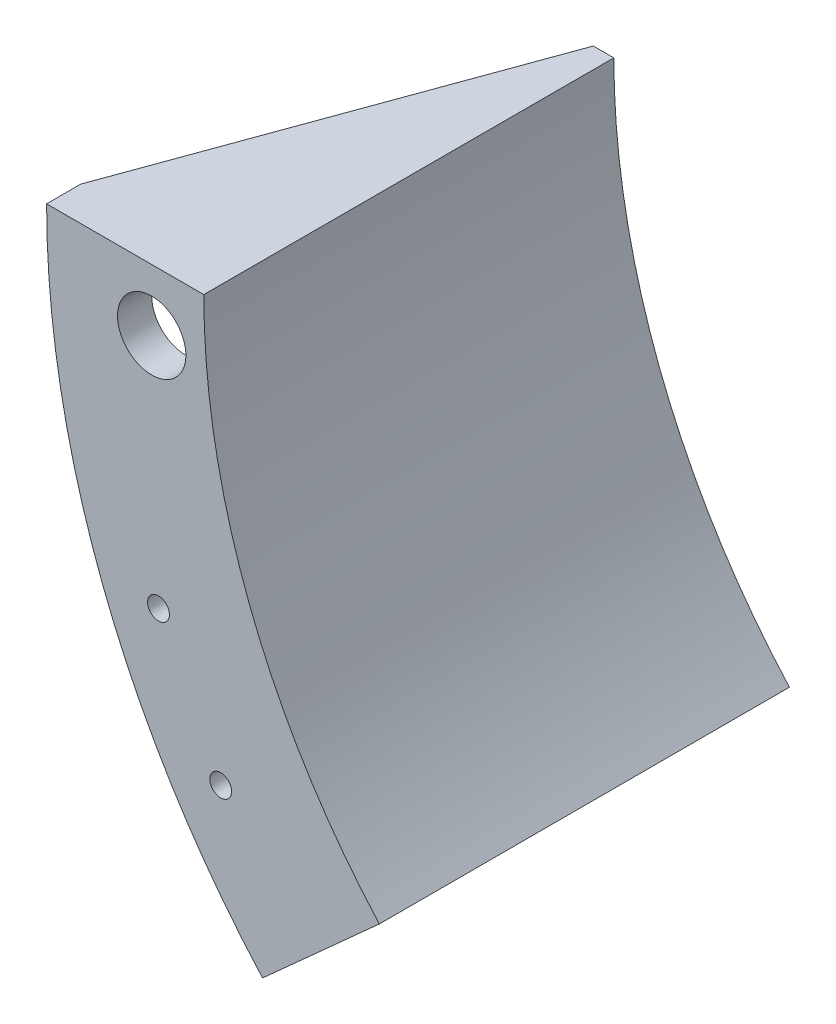
ISO-10303-21;
HEADER;
FILE_DESCRIPTION(('STEP AP214'),'2;1');
FILE_NAME('part.step','',(''),(''),'','','');
FILE_SCHEMA(('AUTOMOTIVE_DESIGN { 1 0 10303 214 1 1 1 1 }'));
ENDSEC;
DATA;
#1=APPLICATION_CONTEXT('core data for automotive mechanical design processes');
#2=APPLICATION_PROTOCOL_DEFINITION('international standard','automotive_design',2000,#1);
#3=PRODUCT_CONTEXT('',#1,'mechanical');
#4=PRODUCT('Part','Part','',(#3));
#5=PRODUCT_RELATED_PRODUCT_CATEGORY('part','',(#4));
#6=PRODUCT_DEFINITION_FORMATION('','',#4);
#7=PRODUCT_DEFINITION_CONTEXT('part definition',#1,'design');
#8=PRODUCT_DEFINITION('design','',#6,#7);
#9=PRODUCT_DEFINITION_SHAPE('','',#8);
#10=(LENGTH_UNIT() NAMED_UNIT(*) SI_UNIT(.MILLI.,.METRE.));
#11=(NAMED_UNIT(*) PLANE_ANGLE_UNIT() SI_UNIT($,.RADIAN.));
#12=(NAMED_UNIT(*) SI_UNIT($,.STERADIAN.) SOLID_ANGLE_UNIT());
#13=UNCERTAINTY_MEASURE_WITH_UNIT(LENGTH_MEASURE(1.E-05),#10,'distance_accuracy_value','');
#14=(GEOMETRIC_REPRESENTATION_CONTEXT(3) GLOBAL_UNCERTAINTY_ASSIGNED_CONTEXT((#13)) GLOBAL_UNIT_ASSIGNED_CONTEXT((#10,
#11,#12)) REPRESENTATION_CONTEXT('',''));
#15=CARTESIAN_POINT('',(0.,0.,0.));
#16=DIRECTION('',(0.,0.,1.));
#17=DIRECTION('',(1.,0.,0.));
#18=AXIS2_PLACEMENT_3D('',#15,#16,#17);
#19=CARTESIAN_POINT('',(0.,0.,55.));
#20=DIRECTION('',(0.,0.,1.));
#21=DIRECTION('',(1.,0.,0.));
#22=AXIS2_PLACEMENT_3D('',#19,#20,#21);
#23=PLANE('',#22);
#24=CARTESIAN_POINT('',(0.,0.,55.));
#25=DIRECTION('',(0.,0.,1.));
#26=DIRECTION('',(1.,0.,0.));
#27=AXIS2_PLACEMENT_3D('',#24,#25,#26);
#28=CIRCLE('',#27,103.);
#29=CARTESIAN_POINT('',(-102.922300790451,-4.,55.));
#30=VERTEX_POINT('',#29);
#31=CARTESIAN_POINT('',(-102.641738044954,-8.58333333333333,55.));
#32=VERTEX_POINT('',#31);
#33=EDGE_CURVE('E126',#30,#32,#28,.T.);
#34=ORIENTED_EDGE('',*,*,#33,.T.);
#35=CARTESIAN_POINT('',(-107.624346687913,-9.,55.));
#36=DIRECTION('',(0.,0.,-1.));
#37=DIRECTION('',(-1.,0.,0.));
#38=AXIS2_PLACEMENT_3D('',#35,#36,#37);
#39=CIRCLE('',#38,5.);
#40=CARTESIAN_POINT('',(-107.624346687913,-4.,55.));
#41=VERTEX_POINT('',#40);
#42=EDGE_CURVE('E49',#41,#32,#39,.T.);
#43=ORIENTED_EDGE('',*,*,#42,.F.);
#44=DIRECTION('',(1.,0.,0.));
#45=VECTOR('',#44,1.);
#46=CARTESIAN_POINT('',(-123.,-4.,55.));
#47=LINE('',#46,#45);
#48=EDGE_CURVE('E123',#41,#30,#47,.T.);
#49=ORIENTED_EDGE('',*,*,#48,.T.);
#50=EDGE_LOOP('',(#34,#43,#49));
#51=FACE_BOUND('',#50,.T.);
#52=ADVANCED_FACE('F35',(#51),#23,.F.);
#53=CARTESIAN_POINT('',(0.,0.,60.));
#54=DIRECTION('',(0.,0.,-1.));
#55=DIRECTION('',(-1.,0.,0.));
#56=AXIS2_PLACEMENT_3D('',#53,#54,#55);
#57=CYLINDRICAL_SURFACE('',#56,103.);
#58=CARTESIAN_POINT('',(0.,0.,0.));
#59=DIRECTION('',(0.,0.,1.));
#60=DIRECTION('',(1.,0.,0.));
#61=AXIS2_PLACEMENT_3D('',#58,#59,#60);
#62=CIRCLE('',#61,103.);
#63=CARTESIAN_POINT('',(-102.922300790451,-4.,0.));
#64=VERTEX_POINT('',#63);
#65=CARTESIAN_POINT('',(-79.1626976840863,-65.895882233854,0.));
#66=VERTEX_POINT('',#65);
#67=EDGE_CURVE('E195',#64,#66,#62,.T.);
#68=ORIENTED_EDGE('',*,*,#67,.T.);
#69=DIRECTION('',(0.,0.,-1.));
#70=VECTOR('',#69,1.);
#71=CARTESIAN_POINT('',(-79.1626976840863,-65.895882233854,60.));
#72=LINE('',#71,#70);
#73=CARTESIAN_POINT('',(-79.1626976840863,-65.895882233854,55.));
#74=VERTEX_POINT('',#73);
#75=EDGE_CURVE('E149',#66,#74,#72,.F.);
#76=ORIENTED_EDGE('',*,*,#75,.T.);
#77=EDGE_CURVE('E177',#32,#74,#28,.T.);
#78=ORIENTED_EDGE('',*,*,#77,.F.);
#79=ORIENTED_EDGE('',*,*,#33,.F.);
#80=DIRECTION('',(0.,0.,-1.));
#81=VECTOR('',#80,1.);
#82=CARTESIAN_POINT('',(-102.922300790451,-4.,60.));
#83=LINE('',#82,#81);
#84=EDGE_CURVE('E133',#30,#64,#83,.T.);
#85=ORIENTED_EDGE('',*,*,#84,.T.);
#86=EDGE_LOOP('',(#68,#76,#78,#79,#85));
#87=FACE_BOUND('',#86,.T.);
#88=ADVANCED_FACE('F257',(#87),#57,.T.);
#89=CARTESIAN_POINT('',(0.,0.,60.));
#90=DIRECTION('',(0.,0.,-1.));
#91=DIRECTION('',(-1.,0.,0.));
#92=AXIS2_PLACEMENT_3D('',#89,#90,#91);
#93=CYLINDRICAL_SURFACE('',#92,100.);
#94=CARTESIAN_POINT('',(0.,0.,0.));
#95=DIRECTION('',(0.,0.,-1.));
#96=DIRECTION('',(1.,0.,0.));
#97=AXIS2_PLACEMENT_3D('',#94,#95,#96);
#98=CIRCLE('',#97,100.);
#99=CARTESIAN_POINT('',(-74.3144825477393,-66.913060635886,0.));
#100=VERTEX_POINT('',#99);
#101=CARTESIAN_POINT('',(-100.,0.,0.));
#102=VERTEX_POINT('',#101);
#103=EDGE_CURVE('E181',#100,#102,#98,.T.);
#104=ORIENTED_EDGE('',*,*,#103,.T.);
#105=DIRECTION('',(0.,0.,-1.));
#106=VECTOR('',#105,1.);
#107=CARTESIAN_POINT('',(-100.,0.,60.));
#108=LINE('',#107,#106);
#109=CARTESIAN_POINT('',(-100.,0.,60.));
#110=VERTEX_POINT('',#109);
#111=EDGE_CURVE('E11',#110,#102,#108,.T.);
#112=ORIENTED_EDGE('',*,*,#111,.F.);
#113=CARTESIAN_POINT('',(0.,0.,60.));
#114=DIRECTION('',(0.,0.,-1.));
#115=DIRECTION('',(1.,0.,0.));
#116=AXIS2_PLACEMENT_3D('',#113,#114,#115);
#117=CIRCLE('',#116,100.);
#118=CARTESIAN_POINT('',(-74.3144825477393,-66.913060635886,60.));
#119=VERTEX_POINT('',#118);
#120=EDGE_CURVE('E182',#119,#110,#117,.T.);
#121=ORIENTED_EDGE('',*,*,#120,.F.);
#122=DIRECTION('',(0.,0.,-1.));
#123=VECTOR('',#122,1.);
#124=CARTESIAN_POINT('',(-74.3144825477393,-66.913060635886,60.));
#125=LINE('',#124,#123);
#126=EDGE_CURVE('E43',#119,#100,#125,.T.);
#127=ORIENTED_EDGE('',*,*,#126,.T.);
#128=EDGE_LOOP('',(#104,#112,#121,#127));
#129=FACE_BOUND('',#128,.T.);
#130=ADVANCED_FACE('F37',(#129),#93,.F.);
#131=CARTESIAN_POINT('',(-100.,0.,60.));
#132=DIRECTION('',(0.,-1.,0.));
#133=DIRECTION('',(0.,0.,-1.));
#134=AXIS2_PLACEMENT_3D('',#131,#132,#133);
#135=PLANE('',#134);
#136=DIRECTION('',(-1.,0.,0.));
#137=VECTOR('',#136,1.);
#138=CARTESIAN_POINT('',(-100.,0.,0.));
#139=LINE('',#138,#137);
#140=CARTESIAN_POINT('',(-103.,0.,0.));
#141=VERTEX_POINT('',#140);
#142=EDGE_CURVE('E192',#102,#141,#139,.T.);
#143=ORIENTED_EDGE('',*,*,#142,.T.);
#144=DIRECTION('',(-0.341743063086705,0.,0.939793423488437));
#145=VECTOR('',#144,1.);
#146=CARTESIAN_POINT('',(-103.,0.,0.));
#147=LINE('',#146,#145);
#148=CARTESIAN_POINT('',(-123.,0.,55.));
#149=VERTEX_POINT('',#148);
#150=EDGE_CURVE('E145',#141,#149,#147,.T.);
#151=ORIENTED_EDGE('',*,*,#150,.T.);
#152=DIRECTION('',(0.,0.,1.));
#153=VECTOR('',#152,1.);
#154=CARTESIAN_POINT('',(-123.,0.,55.));
#155=LINE('',#154,#153);
#156=CARTESIAN_POINT('',(-123.,0.,60.));
#157=VERTEX_POINT('',#156);
#158=EDGE_CURVE('E170',#149,#157,#155,.T.);
#159=ORIENTED_EDGE('',*,*,#158,.T.);
#160=DIRECTION('',(-1.,0.,0.));
#161=VECTOR('',#160,1.);
#162=CARTESIAN_POINT('',(-100.,0.,60.));
#163=LINE('',#162,#161);
#164=EDGE_CURVE('E185',#110,#157,#163,.T.);
#165=ORIENTED_EDGE('',*,*,#164,.F.);
#166=ORIENTED_EDGE('',*,*,#111,.T.);
#167=EDGE_LOOP('',(#143,#151,#159,#165,#166));
#168=FACE_BOUND('',#167,.T.);
#169=ADVANCED_FACE('F216',(#168),#135,.F.);
#170=CARTESIAN_POINT('',(-74.3144825477393,-66.913060635886,60.));
#171=DIRECTION('',(-0.669130606358863,0.74314482547739,0.));
#172=DIRECTION('',(-0.74314482547739,-0.669130606358863,0.));
#173=AXIS2_PLACEMENT_3D('',#170,#171,#172);
#174=PLANE('',#173);
#175=DIRECTION('',(0.253964588975677,0.228670743022142,-0.939793423488437));
#176=VECTOR('',#175,1.);
#177=CARTESIAN_POINT('',(-91.4068135337189,-82.3030645821402,55.));
#178=LINE('',#177,#176);
#179=CARTESIAN_POINT('',(-91.4068135337193,-82.3030645821398,55.));
#180=VERTEX_POINT('',#179);
#181=CARTESIAN_POINT('',(-76.5439170241711,-68.9204524549629,0.));
#182=VERTEX_POINT('',#181);
#183=EDGE_CURVE('E209',#180,#182,#178,.T.);
#184=ORIENTED_EDGE('',*,*,#183,.T.);
#185=DIRECTION('',(0.74314482547739,0.669130606358863,0.));
#186=VECTOR('',#185,1.);
#187=CARTESIAN_POINT('',(-74.3144825477393,-66.913060635886,0.));
#188=LINE('',#187,#186);
#189=EDGE_CURVE('E186',#182,#100,#188,.T.);
#190=ORIENTED_EDGE('',*,*,#189,.T.);
#191=ORIENTED_EDGE('',*,*,#126,.F.);
#192=DIRECTION('',(0.74314482547739,0.669130606358863,0.));
#193=VECTOR('',#192,1.);
#194=CARTESIAN_POINT('',(-74.3144825477393,-66.913060635886,60.));
#195=LINE('',#194,#193);
#196=CARTESIAN_POINT('',(-91.4068135337193,-82.3030645821398,60.));
#197=VERTEX_POINT('',#196);
#198=EDGE_CURVE('E188',#197,#119,#195,.T.);
#199=ORIENTED_EDGE('',*,*,#198,.F.);
#200=DIRECTION('',(0.,0.,1.));
#201=VECTOR('',#200,1.);
#202=CARTESIAN_POINT('',(-91.4068135337193,-82.3030645821398,55.));
#203=LINE('',#202,#201);
#204=EDGE_CURVE('E174',#180,#197,#203,.T.);
#205=ORIENTED_EDGE('',*,*,#204,.F.);
#206=EDGE_LOOP('',(#184,#190,#191,#199,#205));
#207=FACE_BOUND('',#206,.T.);
#208=ADVANCED_FACE('F207',(#207),#174,.F.);
#209=CARTESIAN_POINT('',(0.,0.,60.));
#210=DIRECTION('',(0.,0.,1.));
#211=DIRECTION('',(1.,0.,0.));
#212=AXIS2_PLACEMENT_3D('',#209,#210,#211);
#213=PLANE('',#212);
#214=CARTESIAN_POINT('',(-107.624346687913,-9.,60.));
#215=DIRECTION('',(0.,0.,-1.));
#216=DIRECTION('',(-1.,0.,0.));
#217=AXIS2_PLACEMENT_3D('',#214,#215,#216);
#218=CIRCLE('',#217,5.);
#219=CARTESIAN_POINT('',(-112.624346687913,-9.,60.));
#220=VERTEX_POINT('',#219);
#221=EDGE_CURVE('E127',#220,#220,#218,.T.);
#222=ORIENTED_EDGE('',*,*,#221,.T.);
#223=EDGE_LOOP('',(#222));
#224=FACE_BOUND('',#223,.T.);
#225=CARTESIAN_POINT('',(-97.5255310579886,-60.9407153868192,60.));
#226=DIRECTION('',(0.,0.,-1.));
#227=DIRECTION('',(-1.,0.,0.));
#228=AXIS2_PLACEMENT_3D('',#225,#226,#227);
#229=CIRCLE('',#228,1.60000000000001);
#230=CARTESIAN_POINT('',(-99.1255310579886,-60.9407153868192,60.));
#231=VERTEX_POINT('',#230);
#232=EDGE_CURVE('E156',#231,#231,#229,.T.);
#233=ORIENTED_EDGE('',*,*,#232,.T.);
#234=EDGE_LOOP('',(#233));
#235=FACE_BOUND('',#234,.T.);
#236=CARTESIAN_POINT('',(-106.62614327518,-43.0797582428313,60.));
#237=DIRECTION('',(0.,0.,-1.));
#238=DIRECTION('',(-1.,0.,0.));
#239=AXIS2_PLACEMENT_3D('',#236,#237,#238);
#240=CIRCLE('',#239,1.60000000000001);
#241=CARTESIAN_POINT('',(-108.22614327518,-43.0797582428313,60.));
#242=VERTEX_POINT('',#241);
#243=EDGE_CURVE('E163',#242,#242,#240,.T.);
#244=ORIENTED_EDGE('',*,*,#243,.T.);
#245=EDGE_LOOP('',(#244));
#246=FACE_BOUND('',#245,.T.);
#247=ORIENTED_EDGE('',*,*,#164,.T.);
#248=CARTESIAN_POINT('',(0.,0.,60.));
#249=DIRECTION('',(0.,0.,1.));
#250=DIRECTION('',(1.,0.,0.));
#251=AXIS2_PLACEMENT_3D('',#248,#249,#250);
#252=CIRCLE('',#251,123.);
#253=EDGE_CURVE('E159',#157,#197,#252,.T.);
#254=ORIENTED_EDGE('',*,*,#253,.T.);
#255=ORIENTED_EDGE('',*,*,#198,.T.);
#256=ORIENTED_EDGE('',*,*,#120,.T.);
#257=EDGE_LOOP('',(#247,#254,#255,#256));
#258=FACE_BOUND('',#257,.T.);
#259=ADVANCED_FACE('F220',(#224,#235,#246,#258),#213,.T.);
#260=CARTESIAN_POINT('',(0.,0.,0.));
#261=DIRECTION('',(0.,0.,1.));
#262=DIRECTION('',(1.,0.,0.));
#263=AXIS2_PLACEMENT_3D('',#260,#261,#262);
#264=PLANE('',#263);
#265=ORIENTED_EDGE('',*,*,#103,.F.);
#266=ORIENTED_EDGE('',*,*,#189,.F.);
#267=DIRECTION('',(0.669130606358863,-0.74314482547739,0.));
#268=VECTOR('',#267,1.);
#269=CARTESIAN_POINT('',(-79.2204394496066,-65.9478731530534,0.));
#270=LINE('',#269,#268);
#271=CARTESIAN_POINT('',(-79.2204394496066,-65.9478731530534,0.));
#272=VERTEX_POINT('',#271);
#273=EDGE_CURVE('E248',#272,#182,#270,.T.);
#274=ORIENTED_EDGE('',*,*,#273,.F.);
#275=DIRECTION('',(0.74314482547739,0.669130606358863,0.));
#276=VECTOR('',#275,1.);
#277=CARTESIAN_POINT('',(-79.2204394496066,-65.9478731530534,0.));
#278=LINE('',#277,#276);
#279=EDGE_CURVE('E241',#272,#66,#278,.T.);
#280=ORIENTED_EDGE('',*,*,#279,.T.);
#281=ORIENTED_EDGE('',*,*,#67,.F.);
#282=DIRECTION('',(-1.,0.,0.));
#283=VECTOR('',#282,1.);
#284=CARTESIAN_POINT('',(-100.,-4.,0.));
#285=LINE('',#284,#283);
#286=CARTESIAN_POINT('',(-103.,-4.,0.));
#287=VERTEX_POINT('',#286);
#288=EDGE_CURVE('E148',#64,#287,#285,.T.);
#289=ORIENTED_EDGE('',*,*,#288,.T.);
#290=DIRECTION('',(0.,1.,0.));
#291=VECTOR('',#290,1.);
#292=CARTESIAN_POINT('',(-103.,-4.,0.));
#293=LINE('',#292,#291);
#294=EDGE_CURVE('E141',#287,#141,#293,.T.);
#295=ORIENTED_EDGE('',*,*,#294,.T.);
#296=ORIENTED_EDGE('',*,*,#142,.F.);
#297=EDGE_LOOP('',(#265,#266,#274,#280,#281,#289,#295,#296));
#298=FACE_BOUND('',#297,.T.);
#299=ADVANCED_FACE('F212',(#298),#264,.F.);
#300=CARTESIAN_POINT('',(-97.5255310579886,-60.9407153868192,55.));
#301=DIRECTION('',(0.,0.,-1.));
#302=DIRECTION('',(-1.,0.,0.));
#303=AXIS2_PLACEMENT_3D('',#300,#301,#302);
#304=CIRCLE('',#303,1.60000000000001);
#305=CARTESIAN_POINT('',(-99.1255310579886,-60.9407153868192,55.));
#306=VERTEX_POINT('',#305);
#307=EDGE_CURVE('E160',#306,#306,#304,.T.);
#308=ORIENTED_EDGE('',*,*,#307,.F.);
#309=EDGE_LOOP('',(#308));
#310=FACE_BOUND('',#309,.T.);
#311=CARTESIAN_POINT('',(-106.62614327518,-43.0797582428313,55.));
#312=DIRECTION('',(0.,0.,-1.));
#313=DIRECTION('',(-1.,0.,0.));
#314=AXIS2_PLACEMENT_3D('',#311,#312,#313);
#315=CIRCLE('',#314,1.60000000000001);
#316=CARTESIAN_POINT('',(-108.22614327518,-43.0797582428313,55.));
#317=VERTEX_POINT('',#316);
#318=EDGE_CURVE('E155',#317,#317,#315,.T.);
#319=ORIENTED_EDGE('',*,*,#318,.F.);
#320=EDGE_LOOP('',(#319));
#321=FACE_BOUND('',#320,.T.);
#322=CARTESIAN_POINT('',(-122.934942144209,-4.,55.));
#323=VERTEX_POINT('',#322);
#324=EDGE_CURVE('E130',#323,#41,#47,.T.);
#325=ORIENTED_EDGE('',*,*,#324,.T.);
#326=EDGE_CURVE('E114',#32,#41,#39,.T.);
#327=ORIENTED_EDGE('',*,*,#326,.F.);
#328=ORIENTED_EDGE('',*,*,#77,.T.);
#329=DIRECTION('',(-0.74314482547739,-0.669130606358863,0.));
#330=VECTOR('',#329,1.);
#331=CARTESIAN_POINT('',(-76.9910049731744,-63.9404813339768,55.));
#332=LINE('',#331,#330);
#333=CARTESIAN_POINT('',(-94.0349885502666,-79.2869530777368,55.));
#334=VERTEX_POINT('',#333);
#335=EDGE_CURVE('E235',#74,#334,#332,.T.);
#336=ORIENTED_EDGE('',*,*,#335,.T.);
#337=CARTESIAN_POINT('',(0.,0.,55.));
#338=DIRECTION('',(0.,0.,1.));
#339=DIRECTION('',(1.,0.,0.));
#340=AXIS2_PLACEMENT_3D('',#337,#338,#339);
#341=CIRCLE('',#340,123.);
#342=EDGE_CURVE('E139',#323,#334,#341,.T.);
#343=ORIENTED_EDGE('',*,*,#342,.F.);
#344=EDGE_LOOP('',(#325,#327,#328,#336,#343));
#345=FACE_BOUND('',#344,.T.);
#346=ADVANCED_FACE('F136',(#310,#321,#345),#23,.F.);
#347=CARTESIAN_POINT('',(0.,0.,55.));
#348=DIRECTION('',(0.,0.,1.));
#349=DIRECTION('',(1.,0.,0.));
#350=AXIS2_PLACEMENT_3D('',#347,#348,#349);
#351=CYLINDRICAL_SURFACE('',#350,123.);
#352=ORIENTED_EDGE('',*,*,#253,.F.);
#353=ORIENTED_EDGE('',*,*,#158,.F.);
#354=EDGE_CURVE('E168',#149,#323,#341,.T.);
#355=ORIENTED_EDGE('',*,*,#354,.T.);
#356=ORIENTED_EDGE('',*,*,#342,.T.);
#357=EDGE_CURVE('E171',#334,#180,#341,.T.);
#358=ORIENTED_EDGE('',*,*,#357,.T.);
#359=ORIENTED_EDGE('',*,*,#204,.T.);
#360=EDGE_LOOP('',(#352,#353,#355,#356,#358,#359));
#361=FACE_BOUND('',#360,.T.);
#362=ADVANCED_FACE('F223',(#361),#351,.T.);
#363=CARTESIAN_POINT('',(-106.62614327518,-43.0797582428313,60.));
#364=DIRECTION('',(0.,0.,-1.));
#365=DIRECTION('',(-1.,0.,0.));
#366=AXIS2_PLACEMENT_3D('',#363,#364,#365);
#367=CYLINDRICAL_SURFACE('',#366,1.60000000000001);
#368=ORIENTED_EDGE('',*,*,#243,.F.);
#369=EDGE_LOOP('',(#368));
#370=FACE_BOUND('',#369,.T.);
#371=ORIENTED_EDGE('',*,*,#318,.T.);
#372=EDGE_LOOP('',(#371));
#373=FACE_BOUND('',#372,.T.);
#374=ADVANCED_FACE('F284',(#370,#373),#367,.F.);
#375=CARTESIAN_POINT('',(-97.5255310579886,-60.9407153868192,60.));
#376=DIRECTION('',(0.,0.,-1.));
#377=DIRECTION('',(-1.,0.,0.));
#378=AXIS2_PLACEMENT_3D('',#375,#376,#377);
#379=CYLINDRICAL_SURFACE('',#378,1.60000000000001);
#380=ORIENTED_EDGE('',*,*,#232,.F.);
#381=EDGE_LOOP('',(#380));
#382=FACE_BOUND('',#381,.T.);
#383=ORIENTED_EDGE('',*,*,#307,.T.);
#384=EDGE_LOOP('',(#383));
#385=FACE_BOUND('',#384,.T.);
#386=ADVANCED_FACE('F291',(#382,#385),#379,.F.);
#387=CARTESIAN_POINT('',(0.,-4.,0.));
#388=DIRECTION('',(0.,-1.,0.));
#389=DIRECTION('',(0.,0.,-1.));
#390=AXIS2_PLACEMENT_3D('',#387,#388,#389);
#391=PLANE('',#390);
#392=ORIENTED_EDGE('',*,*,#84,.F.);
#393=ORIENTED_EDGE('',*,*,#48,.F.);
#394=ORIENTED_EDGE('',*,*,#324,.F.);
#395=CARTESIAN_POINT('',(-123.,-4.,55.));
#396=VERTEX_POINT('',#395);
#397=EDGE_CURVE('E57',#396,#323,#47,.T.);
#398=ORIENTED_EDGE('',*,*,#397,.F.);
#399=DIRECTION('',(-0.341743063086705,0.,0.939793423488437));
#400=VECTOR('',#399,1.);
#401=CARTESIAN_POINT('',(-103.,-4.,0.));
#402=LINE('',#401,#400);
#403=EDGE_CURVE('E134',#287,#396,#402,.T.);
#404=ORIENTED_EDGE('',*,*,#403,.F.);
#405=ORIENTED_EDGE('',*,*,#288,.F.);
#406=EDGE_LOOP('',(#392,#393,#394,#398,#404,#405));
#407=FACE_BOUND('',#406,.T.);
#408=ADVANCED_FACE('F129',(#407),#391,.T.);
#409=CARTESIAN_POINT('',(-123.,-4.,55.));
#410=DIRECTION('',(0.,0.,1.));
#411=DIRECTION('',(1.,0.,0.));
#412=AXIS2_PLACEMENT_3D('',#409,#410,#411);
#413=PLANE('',#412);
#414=ORIENTED_EDGE('',*,*,#397,.T.);
#415=ORIENTED_EDGE('',*,*,#354,.F.);
#416=DIRECTION('',(0.,1.,0.));
#417=VECTOR('',#416,1.);
#418=CARTESIAN_POINT('',(-123.,-4.,55.));
#419=LINE('',#418,#417);
#420=EDGE_CURVE('E150',#396,#149,#419,.T.);
#421=ORIENTED_EDGE('',*,*,#420,.F.);
#422=EDGE_LOOP('',(#414,#415,#421));
#423=FACE_BOUND('',#422,.T.);
#424=ADVANCED_FACE('F302',(#423),#413,.T.);
#425=CARTESIAN_POINT('',(-103.,-4.,0.));
#426=DIRECTION('',(-0.939793423488437,0.,-0.341743063086705));
#427=DIRECTION('',(-0.341743063086705,0.,0.939793423488437));
#428=AXIS2_PLACEMENT_3D('',#425,#426,#427);
#429=PLANE('',#428);
#430=ORIENTED_EDGE('',*,*,#150,.F.);
#431=ORIENTED_EDGE('',*,*,#294,.F.);
#432=ORIENTED_EDGE('',*,*,#403,.T.);
#433=ORIENTED_EDGE('',*,*,#420,.T.);
#434=EDGE_LOOP('',(#430,#431,#432,#433));
#435=FACE_BOUND('',#434,.T.);
#436=ADVANCED_FACE('F255',(#435),#429,.T.);
#437=CARTESIAN_POINT('',(-2.67652242543543,2.97257930190954,0.));
#438=DIRECTION('',(-0.669130606358863,0.74314482547739,0.));
#439=DIRECTION('',(-0.74314482547739,-0.669130606358863,0.));
#440=AXIS2_PLACEMENT_3D('',#437,#438,#439);
#441=PLANE('',#440);
#442=ORIENTED_EDGE('',*,*,#75,.F.);
#443=ORIENTED_EDGE('',*,*,#279,.F.);
#444=DIRECTION('',(0.253964588975677,0.228670743022142,-0.939793423488437));
#445=VECTOR('',#444,1.);
#446=CARTESIAN_POINT('',(-94.0833359591544,-79.3304852802306,55.));
#447=LINE('',#446,#445);
#448=CARTESIAN_POINT('',(-94.0833359591544,-79.3304852802306,55.));
#449=VERTEX_POINT('',#448);
#450=EDGE_CURVE('E239',#449,#272,#447,.T.);
#451=ORIENTED_EDGE('',*,*,#450,.F.);
#452=EDGE_CURVE('E228',#334,#449,#332,.T.);
#453=ORIENTED_EDGE('',*,*,#452,.F.);
#454=ORIENTED_EDGE('',*,*,#335,.F.);
#455=EDGE_LOOP('',(#442,#443,#451,#453,#454));
#456=FACE_BOUND('',#455,.T.);
#457=ADVANCED_FACE('F234',(#456),#441,.T.);
#458=CARTESIAN_POINT('',(-76.9910049731744,-63.9404813339768,55.));
#459=DIRECTION('',(0.,0.,1.));
#460=DIRECTION('',(1.,0.,0.));
#461=AXIS2_PLACEMENT_3D('',#458,#459,#460);
#462=PLANE('',#461);
#463=DIRECTION('',(0.669130606358863,-0.74314482547739,0.));
#464=VECTOR('',#463,1.);
#465=CARTESIAN_POINT('',(-94.0833359591544,-79.3304852802306,55.));
#466=LINE('',#465,#464);
#467=EDGE_CURVE('E230',#449,#180,#466,.T.);
#468=ORIENTED_EDGE('',*,*,#467,.T.);
#469=ORIENTED_EDGE('',*,*,#357,.F.);
#470=ORIENTED_EDGE('',*,*,#452,.T.);
#471=EDGE_LOOP('',(#468,#469,#470));
#472=FACE_BOUND('',#471,.T.);
#473=ADVANCED_FACE('F227',(#472),#462,.T.);
#474=CARTESIAN_POINT('',(-94.0833359591544,-79.3304852802306,55.));
#475=DIRECTION('',(-0.698402619683113,-0.62884454331089,-0.341743063086704));
#476=DIRECTION('',(0.669130606358863,-0.74314482547739,0.));
#477=AXIS2_PLACEMENT_3D('',#474,#475,#476);
#478=PLANE('',#477);
#479=ORIENTED_EDGE('',*,*,#183,.F.);
#480=ORIENTED_EDGE('',*,*,#467,.F.);
#481=ORIENTED_EDGE('',*,*,#450,.T.);
#482=ORIENTED_EDGE('',*,*,#273,.T.);
#483=EDGE_LOOP('',(#479,#480,#481,#482));
#484=FACE_BOUND('',#483,.T.);
#485=ADVANCED_FACE('F259',(#484),#478,.T.);
#486=CARTESIAN_POINT('',(-107.624346687913,-9.,60.));
#487=DIRECTION('',(0.,0.,-1.));
#488=DIRECTION('',(-1.,0.,0.));
#489=AXIS2_PLACEMENT_3D('',#486,#487,#488);
#490=CYLINDRICAL_SURFACE('',#489,5.);
#491=ORIENTED_EDGE('',*,*,#221,.F.);
#492=EDGE_LOOP('',(#491));
#493=FACE_BOUND('',#492,.T.);
#494=ORIENTED_EDGE('',*,*,#42,.T.);
#495=ORIENTED_EDGE('',*,*,#326,.T.);
#496=EDGE_LOOP('',(#494,#495));
#497=FACE_BOUND('',#496,.T.);
#498=ADVANCED_FACE('F115',(#493,#497),#490,.F.);
#499=CLOSED_SHELL('',(#52,#88,#130,#169,#208,#259,#299,#346,#362,#374,#386,#408,#424,#436,#457,
#473,#485,#498));
#500=MANIFOLD_SOLID_BREP('B2',#499);
#501=ADVANCED_BREP_SHAPE_REPRESENTATION('',(#18,#500),#14);
#502=SHAPE_DEFINITION_REPRESENTATION(#9,#501);
ENDSEC;
END-ISO-10303-21;
